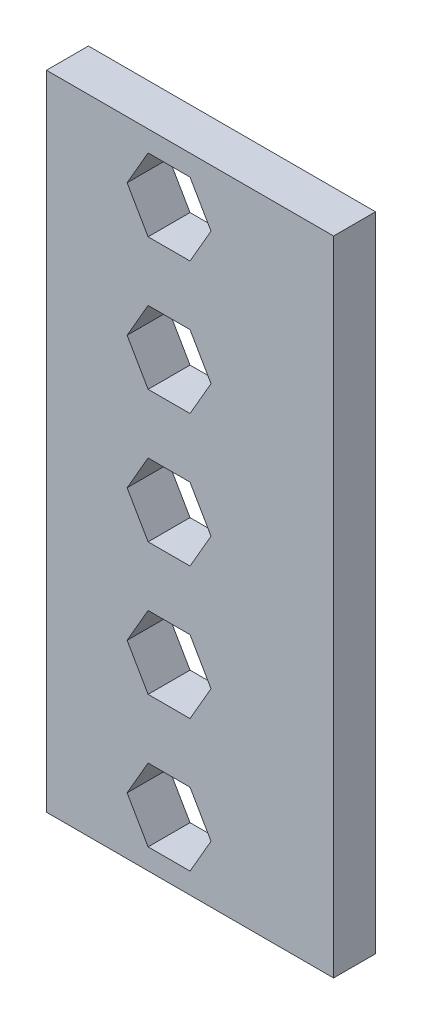
ISO-10303-21;
HEADER;
FILE_DESCRIPTION(('STEP AP214'),'2;1');
FILE_NAME('part.step','',(''),(''),'','','');
FILE_SCHEMA(('AUTOMOTIVE_DESIGN { 1 0 10303 214 1 1 1 1 }'));
ENDSEC;
DATA;
#1=APPLICATION_CONTEXT('core data for automotive mechanical design processes');
#2=APPLICATION_PROTOCOL_DEFINITION('international standard','automotive_design',2000,#1);
#3=PRODUCT_CONTEXT('',#1,'mechanical');
#4=PRODUCT('Part','Part','',(#3));
#5=PRODUCT_RELATED_PRODUCT_CATEGORY('part','',(#4));
#6=PRODUCT_DEFINITION_FORMATION('','',#4);
#7=PRODUCT_DEFINITION_CONTEXT('part definition',#1,'design');
#8=PRODUCT_DEFINITION('design','',#6,#7);
#9=PRODUCT_DEFINITION_SHAPE('','',#8);
#10=(LENGTH_UNIT() NAMED_UNIT(*) SI_UNIT(.MILLI.,.METRE.));
#11=(NAMED_UNIT(*) PLANE_ANGLE_UNIT() SI_UNIT($,.RADIAN.));
#12=(NAMED_UNIT(*) SI_UNIT($,.STERADIAN.) SOLID_ANGLE_UNIT());
#13=UNCERTAINTY_MEASURE_WITH_UNIT(LENGTH_MEASURE(1.E-05),#10,'distance_accuracy_value','');
#14=(GEOMETRIC_REPRESENTATION_CONTEXT(3) GLOBAL_UNCERTAINTY_ASSIGNED_CONTEXT((#13)) GLOBAL_UNIT_ASSIGNED_CONTEXT((#10,
#11,#12)) REPRESENTATION_CONTEXT('',''));
#15=CARTESIAN_POINT('',(0.,0.,0.));
#16=DIRECTION('',(0.,0.,1.));
#17=DIRECTION('',(1.,0.,0.));
#18=AXIS2_PLACEMENT_3D('',#15,#16,#17);
#19=CARTESIAN_POINT('',(0.,0.,3.175));
#20=DIRECTION('',(0.,0.,1.));
#21=DIRECTION('',(1.,0.,0.));
#22=AXIS2_PLACEMENT_3D('',#19,#20,#21);
#23=PLANE('',#22);
#24=DIRECTION('',(0.5,0.866025403784439,0.));
#25=VECTOR('',#24,1.);
#26=CARTESIAN_POINT('',(1.58771324027147,7.25,3.175));
#27=LINE('',#26,#25);
#28=CARTESIAN_POINT('',(1.58771324027147,7.25,3.175));
#29=VERTEX_POINT('',#28);
#30=CARTESIAN_POINT('',(3.17542648054294,10.,3.175));
#31=VERTEX_POINT('',#30);
#32=EDGE_CURVE('E56',#29,#31,#27,.T.);
#33=ORIENTED_EDGE('',*,*,#32,.F.);
#34=DIRECTION('',(1.,0.,0.));
#35=VECTOR('',#34,1.);
#36=CARTESIAN_POINT('',(-1.58771324027147,7.25,3.175));
#37=LINE('',#36,#35);
#38=CARTESIAN_POINT('',(-1.58771324027147,7.25,3.175));
#39=VERTEX_POINT('',#38);
#40=EDGE_CURVE('E294',#39,#29,#37,.T.);
#41=ORIENTED_EDGE('',*,*,#40,.F.);
#42=DIRECTION('',(0.5,-0.866025403784439,0.));
#43=VECTOR('',#42,1.);
#44=CARTESIAN_POINT('',(-3.17542648054294,9.99999999999999,3.175));
#45=LINE('',#44,#43);
#46=CARTESIAN_POINT('',(-3.17542648054294,9.99999999999999,3.175));
#47=VERTEX_POINT('',#46);
#48=EDGE_CURVE('E288',#47,#39,#45,.T.);
#49=ORIENTED_EDGE('',*,*,#48,.F.);
#50=DIRECTION('',(-0.5,-0.866025403784439,0.));
#51=VECTOR('',#50,1.);
#52=CARTESIAN_POINT('',(-1.58771324027146,12.75,3.175));
#53=LINE('',#52,#51);
#54=CARTESIAN_POINT('',(-1.58771324027146,12.75,3.175));
#55=VERTEX_POINT('',#54);
#56=EDGE_CURVE('E286',#55,#47,#53,.T.);
#57=ORIENTED_EDGE('',*,*,#56,.F.);
#58=DIRECTION('',(-1.,0.,0.));
#59=VECTOR('',#58,1.);
#60=CARTESIAN_POINT('',(1.58771324027147,12.75,3.175));
#61=LINE('',#60,#59);
#62=CARTESIAN_POINT('',(1.58771324027147,12.75,3.175));
#63=VERTEX_POINT('',#62);
#64=EDGE_CURVE('E269',#63,#55,#61,.T.);
#65=ORIENTED_EDGE('',*,*,#64,.F.);
#66=DIRECTION('',(-0.5,0.866025403784439,0.));
#67=VECTOR('',#66,1.);
#68=CARTESIAN_POINT('',(3.17542648054294,10.,3.175));
#69=LINE('',#68,#67);
#70=EDGE_CURVE('E279',#31,#63,#69,.T.);
#71=ORIENTED_EDGE('',*,*,#70,.F.);
#72=EDGE_LOOP('',(#33,#41,#49,#57,#65,#71));
#73=FACE_BOUND('',#72,.T.);
#74=DIRECTION('',(0.5,0.866025403784439,0.));
#75=VECTOR('',#74,1.);
#76=CARTESIAN_POINT('',(1.58771324027147,-2.75,3.175));
#77=LINE('',#76,#75);
#78=CARTESIAN_POINT('',(1.58771324027147,-2.75,3.175));
#79=VERTEX_POINT('',#78);
#80=CARTESIAN_POINT('',(3.17542648054294,0.,3.175));
#81=VERTEX_POINT('',#80);
#82=EDGE_CURVE('E64',#79,#81,#77,.T.);
#83=ORIENTED_EDGE('',*,*,#82,.F.);
#84=DIRECTION('',(1.,0.,0.));
#85=VECTOR('',#84,1.);
#86=CARTESIAN_POINT('',(-1.58771324027147,-2.75,3.175));
#87=LINE('',#86,#85);
#88=CARTESIAN_POINT('',(-1.58771324027147,-2.75,3.175));
#89=VERTEX_POINT('',#88);
#90=EDGE_CURVE('E320',#89,#79,#87,.T.);
#91=ORIENTED_EDGE('',*,*,#90,.F.);
#92=DIRECTION('',(0.5,-0.866025403784439,0.));
#93=VECTOR('',#92,1.);
#94=CARTESIAN_POINT('',(-3.17542648054294,0.,3.175));
#95=LINE('',#94,#93);
#96=CARTESIAN_POINT('',(-3.17542648054294,0.,3.175));
#97=VERTEX_POINT('',#96);
#98=EDGE_CURVE('E317',#97,#89,#95,.T.);
#99=ORIENTED_EDGE('',*,*,#98,.F.);
#100=DIRECTION('',(-0.5,-0.866025403784439,0.));
#101=VECTOR('',#100,1.);
#102=CARTESIAN_POINT('',(-1.58771324027146,2.75,3.175));
#103=LINE('',#102,#101);
#104=CARTESIAN_POINT('',(-1.58771324027146,2.75,3.175));
#105=VERTEX_POINT('',#104);
#106=EDGE_CURVE('E314',#105,#97,#103,.T.);
#107=ORIENTED_EDGE('',*,*,#106,.F.);
#108=DIRECTION('',(-1.,0.,0.));
#109=VECTOR('',#108,1.);
#110=CARTESIAN_POINT('',(1.58771324027147,2.75,3.175));
#111=LINE('',#110,#109);
#112=CARTESIAN_POINT('',(1.58771324027147,2.75,3.175));
#113=VERTEX_POINT('',#112);
#114=EDGE_CURVE('E311',#113,#105,#111,.T.);
#115=ORIENTED_EDGE('',*,*,#114,.F.);
#116=DIRECTION('',(-0.5,0.866025403784439,0.));
#117=VECTOR('',#116,1.);
#118=CARTESIAN_POINT('',(3.17542648054294,0.,3.175));
#119=LINE('',#118,#117);
#120=EDGE_CURVE('E307',#81,#113,#119,.T.);
#121=ORIENTED_EDGE('',*,*,#120,.F.);
#122=EDGE_LOOP('',(#83,#91,#99,#107,#115,#121));
#123=FACE_BOUND('',#122,.T.);
#124=DIRECTION('',(0.5,0.866025403784439,0.));
#125=VECTOR('',#124,1.);
#126=CARTESIAN_POINT('',(1.58771324027147,-12.75,3.175));
#127=LINE('',#126,#125);
#128=CARTESIAN_POINT('',(1.58771324027147,-12.75,3.175));
#129=VERTEX_POINT('',#128);
#130=CARTESIAN_POINT('',(3.17542648054294,-10.,3.175));
#131=VERTEX_POINT('',#130);
#132=EDGE_CURVE('E335',#129,#131,#127,.T.);
#133=ORIENTED_EDGE('',*,*,#132,.F.);
#134=DIRECTION('',(1.,0.,0.));
#135=VECTOR('',#134,1.);
#136=CARTESIAN_POINT('',(-1.58771324027147,-12.75,3.175));
#137=LINE('',#136,#135);
#138=CARTESIAN_POINT('',(-1.58771324027147,-12.75,3.175));
#139=VERTEX_POINT('',#138);
#140=EDGE_CURVE('E350',#139,#129,#137,.T.);
#141=ORIENTED_EDGE('',*,*,#140,.F.);
#142=DIRECTION('',(0.5,-0.866025403784439,0.));
#143=VECTOR('',#142,1.);
#144=CARTESIAN_POINT('',(-3.17542648054294,-10.,3.175));
#145=LINE('',#144,#143);
#146=CARTESIAN_POINT('',(-3.17542648054294,-10.,3.175));
#147=VERTEX_POINT('',#146);
#148=EDGE_CURVE('E347',#147,#139,#145,.T.);
#149=ORIENTED_EDGE('',*,*,#148,.F.);
#150=DIRECTION('',(-0.5,-0.866025403784439,0.));
#151=VECTOR('',#150,1.);
#152=CARTESIAN_POINT('',(-1.58771324027146,-7.25,3.175));
#153=LINE('',#152,#151);
#154=CARTESIAN_POINT('',(-1.58771324027146,-7.25,3.175));
#155=VERTEX_POINT('',#154);
#156=EDGE_CURVE('E344',#155,#147,#153,.T.);
#157=ORIENTED_EDGE('',*,*,#156,.F.);
#158=DIRECTION('',(-1.,0.,0.));
#159=VECTOR('',#158,1.);
#160=CARTESIAN_POINT('',(1.58771324027147,-7.25,3.175));
#161=LINE('',#160,#159);
#162=CARTESIAN_POINT('',(1.58771324027147,-7.25,3.175));
#163=VERTEX_POINT('',#162);
#164=EDGE_CURVE('E341',#163,#155,#161,.T.);
#165=ORIENTED_EDGE('',*,*,#164,.F.);
#166=DIRECTION('',(-0.5,0.866025403784439,0.));
#167=VECTOR('',#166,1.);
#168=CARTESIAN_POINT('',(3.17542648054294,-10.,3.175));
#169=LINE('',#168,#167);
#170=EDGE_CURVE('E337',#131,#163,#169,.T.);
#171=ORIENTED_EDGE('',*,*,#170,.F.);
#172=EDGE_LOOP('',(#133,#141,#149,#157,#165,#171));
#173=FACE_BOUND('',#172,.T.);
#174=DIRECTION('',(0.5,0.866025403784439,0.));
#175=VECTOR('',#174,1.);
#176=CARTESIAN_POINT('',(1.58771324027147,-22.75,3.175));
#177=LINE('',#176,#175);
#178=CARTESIAN_POINT('',(1.58771324027147,-22.75,3.175));
#179=VERTEX_POINT('',#178);
#180=CARTESIAN_POINT('',(3.17542648054294,-20.,3.175));
#181=VERTEX_POINT('',#180);
#182=EDGE_CURVE('E365',#179,#181,#177,.T.);
#183=ORIENTED_EDGE('',*,*,#182,.F.);
#184=DIRECTION('',(1.,0.,0.));
#185=VECTOR('',#184,1.);
#186=CARTESIAN_POINT('',(-1.58771324027147,-22.75,3.175));
#187=LINE('',#186,#185);
#188=CARTESIAN_POINT('',(-1.58771324027147,-22.75,3.175));
#189=VERTEX_POINT('',#188);
#190=EDGE_CURVE('E379',#189,#179,#187,.T.);
#191=ORIENTED_EDGE('',*,*,#190,.F.);
#192=DIRECTION('',(0.5,-0.866025403784439,0.));
#193=VECTOR('',#192,1.);
#194=CARTESIAN_POINT('',(-3.17542648054294,-20.,3.175));
#195=LINE('',#194,#193);
#196=CARTESIAN_POINT('',(-3.17542648054294,-20.,3.175));
#197=VERTEX_POINT('',#196);
#198=EDGE_CURVE('E376',#197,#189,#195,.T.);
#199=ORIENTED_EDGE('',*,*,#198,.F.);
#200=DIRECTION('',(-0.5,-0.866025403784439,0.));
#201=VECTOR('',#200,1.);
#202=CARTESIAN_POINT('',(-1.58771324027146,-17.25,3.175));
#203=LINE('',#202,#201);
#204=CARTESIAN_POINT('',(-1.58771324027146,-17.25,3.175));
#205=VERTEX_POINT('',#204);
#206=EDGE_CURVE('E373',#205,#197,#203,.T.);
#207=ORIENTED_EDGE('',*,*,#206,.F.);
#208=DIRECTION('',(-1.,0.,0.));
#209=VECTOR('',#208,1.);
#210=CARTESIAN_POINT('',(1.58771324027147,-17.25,3.175));
#211=LINE('',#210,#209);
#212=CARTESIAN_POINT('',(1.58771324027147,-17.25,3.175));
#213=VERTEX_POINT('',#212);
#214=EDGE_CURVE('E370',#213,#205,#211,.T.);
#215=ORIENTED_EDGE('',*,*,#214,.F.);
#216=DIRECTION('',(-0.5,0.866025403784439,0.));
#217=VECTOR('',#216,1.);
#218=CARTESIAN_POINT('',(3.17542648054294,-20.,3.175));
#219=LINE('',#218,#217);
#220=EDGE_CURVE('E367',#181,#213,#219,.T.);
#221=ORIENTED_EDGE('',*,*,#220,.F.);
#222=EDGE_LOOP('',(#183,#191,#199,#207,#215,#221));
#223=FACE_BOUND('',#222,.T.);
#224=DIRECTION('',(0.5,0.866025403784439,0.));
#225=VECTOR('',#224,1.);
#226=CARTESIAN_POINT('',(1.58771324027147,17.25,3.175));
#227=LINE('',#226,#225);
#228=CARTESIAN_POINT('',(1.58771324027147,17.25,3.175));
#229=VERTEX_POINT('',#228);
#230=CARTESIAN_POINT('',(3.17542648054294,20.,3.175));
#231=VERTEX_POINT('',#230);
#232=EDGE_CURVE('E299',#229,#231,#227,.T.);
#233=ORIENTED_EDGE('',*,*,#232,.F.);
#234=DIRECTION('',(1.,0.,0.));
#235=VECTOR('',#234,1.);
#236=CARTESIAN_POINT('',(-1.58771324027147,17.25,3.175));
#237=LINE('',#236,#235);
#238=CARTESIAN_POINT('',(-1.58771324027147,17.25,3.175));
#239=VERTEX_POINT('',#238);
#240=EDGE_CURVE('E407',#239,#229,#237,.T.);
#241=ORIENTED_EDGE('',*,*,#240,.F.);
#242=DIRECTION('',(0.5,-0.866025403784439,0.));
#243=VECTOR('',#242,1.);
#244=CARTESIAN_POINT('',(-3.17542648054294,20.,3.175));
#245=LINE('',#244,#243);
#246=CARTESIAN_POINT('',(-3.17542648054294,20.,3.175));
#247=VERTEX_POINT('',#246);
#248=EDGE_CURVE('E404',#247,#239,#245,.T.);
#249=ORIENTED_EDGE('',*,*,#248,.F.);
#250=DIRECTION('',(-0.5,-0.866025403784439,0.));
#251=VECTOR('',#250,1.);
#252=CARTESIAN_POINT('',(-1.58771324027146,22.75,3.175));
#253=LINE('',#252,#251);
#254=CARTESIAN_POINT('',(-1.58771324027146,22.75,3.175));
#255=VERTEX_POINT('',#254);
#256=EDGE_CURVE('E401',#255,#247,#253,.T.);
#257=ORIENTED_EDGE('',*,*,#256,.F.);
#258=DIRECTION('',(-1.,0.,0.));
#259=VECTOR('',#258,1.);
#260=CARTESIAN_POINT('',(1.58771324027147,22.75,3.175));
#261=LINE('',#260,#259);
#262=CARTESIAN_POINT('',(1.58771324027147,22.75,3.175));
#263=VERTEX_POINT('',#262);
#264=EDGE_CURVE('E398',#263,#255,#261,.T.);
#265=ORIENTED_EDGE('',*,*,#264,.F.);
#266=DIRECTION('',(-0.5,0.866025403784439,0.));
#267=VECTOR('',#266,1.);
#268=CARTESIAN_POINT('',(3.17542648054294,20.,3.175));
#269=LINE('',#268,#267);
#270=EDGE_CURVE('E395',#231,#263,#269,.T.);
#271=ORIENTED_EDGE('',*,*,#270,.F.);
#272=EDGE_LOOP('',(#233,#241,#249,#257,#265,#271));
#273=FACE_BOUND('',#272,.T.);
#274=DIRECTION('',(1.,0.,0.));
#275=VECTOR('',#274,1.);
#276=CARTESIAN_POINT('',(-6.10624999999999,24.325,3.175));
#277=LINE('',#276,#275);
#278=CARTESIAN_POINT('',(-9.28125,24.325,3.175));
#279=VERTEX_POINT('',#278);
#280=CARTESIAN_POINT('',(12.45625,24.325,3.175));
#281=VERTEX_POINT('',#280);
#282=EDGE_CURVE('E432',#279,#281,#277,.T.);
#283=ORIENTED_EDGE('',*,*,#282,.F.);
#284=DIRECTION('',(0.,1.,0.));
#285=VECTOR('',#284,1.);
#286=CARTESIAN_POINT('',(-9.28125,27.5,3.175));
#287=LINE('',#286,#285);
#288=CARTESIAN_POINT('',(-9.28124999999999,-24.325,3.175));
#289=VERTEX_POINT('',#288);
#290=EDGE_CURVE('E435',#289,#279,#287,.T.);
#291=ORIENTED_EDGE('',*,*,#290,.F.);
#292=DIRECTION('',(1.,0.,0.));
#293=VECTOR('',#292,1.);
#294=CARTESIAN_POINT('',(0.243750000000006,-24.325,3.175));
#295=LINE('',#294,#293);
#296=CARTESIAN_POINT('',(12.45625,-24.325,3.175));
#297=VERTEX_POINT('',#296);
#298=EDGE_CURVE('E427',#289,#297,#295,.T.);
#299=ORIENTED_EDGE('',*,*,#298,.T.);
#300=DIRECTION('',(0.,-1.,0.));
#301=VECTOR('',#300,1.);
#302=CARTESIAN_POINT('',(12.45625,-1.5875,3.175));
#303=LINE('',#302,#301);
#304=EDGE_CURVE('E438',#281,#297,#303,.T.);
#305=ORIENTED_EDGE('',*,*,#304,.F.);
#306=EDGE_LOOP('',(#283,#291,#299,#305));
#307=FACE_BOUND('',#306,.T.);
#308=ADVANCED_FACE('F41',(#73,#123,#173,#223,#273,#307),#23,.T.);
#309=CARTESIAN_POINT('',(0.,0.,0.));
#310=DIRECTION('',(0.,0.,1.));
#311=DIRECTION('',(1.,0.,0.));
#312=AXIS2_PLACEMENT_3D('',#309,#310,#311);
#313=PLANE('',#312);
#314=DIRECTION('',(1.,0.,0.));
#315=VECTOR('',#314,1.);
#316=CARTESIAN_POINT('',(0.,7.25,0.));
#317=LINE('',#316,#315);
#318=CARTESIAN_POINT('',(-1.58771324027147,7.25,0.));
#319=VERTEX_POINT('',#318);
#320=CARTESIAN_POINT('',(1.58771324027147,7.25,0.));
#321=VERTEX_POINT('',#320);
#322=EDGE_CURVE('E49',#319,#321,#317,.T.);
#323=ORIENTED_EDGE('',*,*,#322,.T.);
#324=DIRECTION('',(0.5,0.866025403784439,0.));
#325=VECTOR('',#324,1.);
#326=CARTESIAN_POINT('',(-1.94855715851499,1.125,0.));
#327=LINE('',#326,#325);
#328=CARTESIAN_POINT('',(3.17542648054294,10.,0.));
#329=VERTEX_POINT('',#328);
#330=EDGE_CURVE('E11',#321,#329,#327,.T.);
#331=ORIENTED_EDGE('',*,*,#330,.T.);
#332=DIRECTION('',(-0.5,0.866025403784439,0.));
#333=VECTOR('',#332,1.);
#334=CARTESIAN_POINT('',(6.7116968793294,3.87499999999999,0.));
#335=LINE('',#334,#333);
#336=CARTESIAN_POINT('',(1.58771324027147,12.75,0.));
#337=VERTEX_POINT('',#336);
#338=EDGE_CURVE('E529',#329,#337,#335,.T.);
#339=ORIENTED_EDGE('',*,*,#338,.T.);
#340=DIRECTION('',(-1.,0.,0.));
#341=VECTOR('',#340,1.);
#342=CARTESIAN_POINT('',(0.,12.75,0.));
#343=LINE('',#342,#341);
#344=CARTESIAN_POINT('',(-1.58771324027146,12.75,0.));
#345=VERTEX_POINT('',#344);
#346=EDGE_CURVE('E272',#337,#345,#343,.T.);
#347=ORIENTED_EDGE('',*,*,#346,.T.);
#348=DIRECTION('',(-0.5,-0.866025403784439,0.));
#349=VECTOR('',#348,1.);
#350=CARTESIAN_POINT('',(-6.71169687932939,3.875,0.));
#351=LINE('',#350,#349);
#352=CARTESIAN_POINT('',(-3.17542648054294,9.99999999999999,0.));
#353=VERTEX_POINT('',#352);
#354=EDGE_CURVE('E532',#345,#353,#351,.T.);
#355=ORIENTED_EDGE('',*,*,#354,.T.);
#356=DIRECTION('',(0.5,-0.866025403784439,0.));
#357=VECTOR('',#356,1.);
#358=CARTESIAN_POINT('',(1.94855715851498,1.125,0.));
#359=LINE('',#358,#357);
#360=EDGE_CURVE('E535',#353,#319,#359,.T.);
#361=ORIENTED_EDGE('',*,*,#360,.T.);
#362=EDGE_LOOP('',(#323,#331,#339,#347,#355,#361));
#363=FACE_BOUND('',#362,.T.);
#364=DIRECTION('',(1.,0.,0.));
#365=VECTOR('',#364,1.);
#366=CARTESIAN_POINT('',(0.,-2.75,0.));
#367=LINE('',#366,#365);
#368=CARTESIAN_POINT('',(-1.58771324027147,-2.75,0.));
#369=VERTEX_POINT('',#368);
#370=CARTESIAN_POINT('',(1.58771324027147,-2.75,0.));
#371=VERTEX_POINT('',#370);
#372=EDGE_CURVE('E523',#369,#371,#367,.T.);
#373=ORIENTED_EDGE('',*,*,#372,.T.);
#374=DIRECTION('',(0.5,0.866025403784439,0.));
#375=VECTOR('',#374,1.);
#376=CARTESIAN_POINT('',(2.38156986040721,-1.375,0.));
#377=LINE('',#376,#375);
#378=CARTESIAN_POINT('',(3.17542648054294,0.,0.));
#379=VERTEX_POINT('',#378);
#380=EDGE_CURVE('E526',#371,#379,#377,.T.);
#381=ORIENTED_EDGE('',*,*,#380,.T.);
#382=DIRECTION('',(-0.5,0.866025403784439,0.));
#383=VECTOR('',#382,1.);
#384=CARTESIAN_POINT('',(2.38156986040721,1.375,0.));
#385=LINE('',#384,#383);
#386=CARTESIAN_POINT('',(1.58771324027147,2.75,0.));
#387=VERTEX_POINT('',#386);
#388=EDGE_CURVE('E511',#379,#387,#385,.T.);
#389=ORIENTED_EDGE('',*,*,#388,.T.);
#390=DIRECTION('',(-1.,0.,0.));
#391=VECTOR('',#390,1.);
#392=CARTESIAN_POINT('',(0.,2.75,0.));
#393=LINE('',#392,#391);
#394=CARTESIAN_POINT('',(-1.58771324027146,2.75,0.));
#395=VERTEX_POINT('',#394);
#396=EDGE_CURVE('E514',#387,#395,#393,.T.);
#397=ORIENTED_EDGE('',*,*,#396,.T.);
#398=DIRECTION('',(-0.5,-0.866025403784439,0.));
#399=VECTOR('',#398,1.);
#400=CARTESIAN_POINT('',(-2.3815698604072,1.375,0.));
#401=LINE('',#400,#399);
#402=CARTESIAN_POINT('',(-3.17542648054294,0.,0.));
#403=VERTEX_POINT('',#402);
#404=EDGE_CURVE('E517',#395,#403,#401,.T.);
#405=ORIENTED_EDGE('',*,*,#404,.T.);
#406=DIRECTION('',(0.5,-0.866025403784439,0.));
#407=VECTOR('',#406,1.);
#408=CARTESIAN_POINT('',(-2.38156986040721,-1.375,0.));
#409=LINE('',#408,#407);
#410=EDGE_CURVE('E520',#403,#369,#409,.T.);
#411=ORIENTED_EDGE('',*,*,#410,.T.);
#412=EDGE_LOOP('',(#373,#381,#389,#397,#405,#411));
#413=FACE_BOUND('',#412,.T.);
#414=DIRECTION('',(1.,0.,0.));
#415=VECTOR('',#414,1.);
#416=CARTESIAN_POINT('',(0.,-12.75,0.));
#417=LINE('',#416,#415);
#418=CARTESIAN_POINT('',(-1.58771324027147,-12.75,0.));
#419=VERTEX_POINT('',#418);
#420=CARTESIAN_POINT('',(1.58771324027147,-12.75,0.));
#421=VERTEX_POINT('',#420);
#422=EDGE_CURVE('E505',#419,#421,#417,.T.);
#423=ORIENTED_EDGE('',*,*,#422,.T.);
#424=DIRECTION('',(0.5,0.866025403784439,0.));
#425=VECTOR('',#424,1.);
#426=CARTESIAN_POINT('',(6.7116968793294,-3.875,0.));
#427=LINE('',#426,#425);
#428=CARTESIAN_POINT('',(3.17542648054294,-10.,0.));
#429=VERTEX_POINT('',#428);
#430=EDGE_CURVE('E508',#421,#429,#427,.T.);
#431=ORIENTED_EDGE('',*,*,#430,.T.);
#432=DIRECTION('',(-0.5,0.866025403784439,0.));
#433=VECTOR('',#432,1.);
#434=CARTESIAN_POINT('',(-1.94855715851498,-1.125,0.));
#435=LINE('',#434,#433);
#436=CARTESIAN_POINT('',(1.58771324027147,-7.25,0.));
#437=VERTEX_POINT('',#436);
#438=EDGE_CURVE('E493',#429,#437,#435,.T.);
#439=ORIENTED_EDGE('',*,*,#438,.T.);
#440=DIRECTION('',(-1.,0.,0.));
#441=VECTOR('',#440,1.);
#442=CARTESIAN_POINT('',(0.,-7.25,0.));
#443=LINE('',#442,#441);
#444=CARTESIAN_POINT('',(-1.58771324027146,-7.25,0.));
#445=VERTEX_POINT('',#444);
#446=EDGE_CURVE('E496',#437,#445,#443,.T.);
#447=ORIENTED_EDGE('',*,*,#446,.T.);
#448=DIRECTION('',(-0.5,-0.866025403784439,0.));
#449=VECTOR('',#448,1.);
#450=CARTESIAN_POINT('',(1.94855715851499,-1.125,0.));
#451=LINE('',#450,#449);
#452=CARTESIAN_POINT('',(-3.17542648054294,-10.,0.));
#453=VERTEX_POINT('',#452);
#454=EDGE_CURVE('E499',#445,#453,#451,.T.);
#455=ORIENTED_EDGE('',*,*,#454,.T.);
#456=DIRECTION('',(0.5,-0.866025403784439,0.));
#457=VECTOR('',#456,1.);
#458=CARTESIAN_POINT('',(-6.7116968793294,-3.875,0.));
#459=LINE('',#458,#457);
#460=EDGE_CURVE('E502',#453,#419,#459,.T.);
#461=ORIENTED_EDGE('',*,*,#460,.T.);
#462=EDGE_LOOP('',(#423,#431,#439,#447,#455,#461));
#463=FACE_BOUND('',#462,.T.);
#464=DIRECTION('',(1.,0.,0.));
#465=VECTOR('',#464,1.);
#466=CARTESIAN_POINT('',(0.,-22.75,0.));
#467=LINE('',#466,#465);
#468=CARTESIAN_POINT('',(-1.58771324027147,-22.75,0.));
#469=VERTEX_POINT('',#468);
#470=CARTESIAN_POINT('',(1.58771324027147,-22.75,0.));
#471=VERTEX_POINT('',#470);
#472=EDGE_CURVE('E487',#469,#471,#467,.T.);
#473=ORIENTED_EDGE('',*,*,#472,.T.);
#474=DIRECTION('',(0.5,0.866025403784439,0.));
#475=VECTOR('',#474,1.);
#476=CARTESIAN_POINT('',(11.0418238982516,-6.37500000000001,0.));
#477=LINE('',#476,#475);
#478=CARTESIAN_POINT('',(3.17542648054294,-20.,0.));
#479=VERTEX_POINT('',#478);
#480=EDGE_CURVE('E490',#471,#479,#477,.T.);
#481=ORIENTED_EDGE('',*,*,#480,.T.);
#482=DIRECTION('',(-0.5,0.866025403784439,0.));
#483=VECTOR('',#482,1.);
#484=CARTESIAN_POINT('',(-6.27868417743717,-3.62499999999999,0.));
#485=LINE('',#484,#483);
#486=CARTESIAN_POINT('',(1.58771324027147,-17.25,0.));
#487=VERTEX_POINT('',#486);
#488=EDGE_CURVE('E475',#479,#487,#485,.T.);
#489=ORIENTED_EDGE('',*,*,#488,.T.);
#490=DIRECTION('',(-1.,0.,0.));
#491=VECTOR('',#490,1.);
#492=CARTESIAN_POINT('',(0.,-17.25,0.));
#493=LINE('',#492,#491);
#494=CARTESIAN_POINT('',(-1.58771324027146,-17.25,0.));
#495=VERTEX_POINT('',#494);
#496=EDGE_CURVE('E478',#487,#495,#493,.T.);
#497=ORIENTED_EDGE('',*,*,#496,.T.);
#498=DIRECTION('',(-0.5,-0.866025403784439,0.));
#499=VECTOR('',#498,1.);
#500=CARTESIAN_POINT('',(6.27868417743719,-3.625,0.));
#501=LINE('',#500,#499);
#502=CARTESIAN_POINT('',(-3.17542648054294,-20.,0.));
#503=VERTEX_POINT('',#502);
#504=EDGE_CURVE('E481',#495,#503,#501,.T.);
#505=ORIENTED_EDGE('',*,*,#504,.T.);
#506=DIRECTION('',(0.5,-0.866025403784439,0.));
#507=VECTOR('',#506,1.);
#508=CARTESIAN_POINT('',(-11.0418238982516,-6.375,0.));
#509=LINE('',#508,#507);
#510=EDGE_CURVE('E484',#503,#469,#509,.T.);
#511=ORIENTED_EDGE('',*,*,#510,.T.);
#512=EDGE_LOOP('',(#473,#481,#489,#497,#505,#511));
#513=FACE_BOUND('',#512,.T.);
#514=DIRECTION('',(1.,0.,0.));
#515=VECTOR('',#514,1.);
#516=CARTESIAN_POINT('',(0.,17.25,0.));
#517=LINE('',#516,#515);
#518=CARTESIAN_POINT('',(-1.58771324027147,17.25,0.));
#519=VERTEX_POINT('',#518);
#520=CARTESIAN_POINT('',(1.58771324027147,17.25,0.));
#521=VERTEX_POINT('',#520);
#522=EDGE_CURVE('E469',#519,#521,#517,.T.);
#523=ORIENTED_EDGE('',*,*,#522,.T.);
#524=DIRECTION('',(0.5,0.866025403784439,0.));
#525=VECTOR('',#524,1.);
#526=CARTESIAN_POINT('',(-6.27868417743718,3.625,0.));
#527=LINE('',#526,#525);
#528=CARTESIAN_POINT('',(3.17542648054294,20.,0.));
#529=VERTEX_POINT('',#528);
#530=EDGE_CURVE('E472',#521,#529,#527,.T.);
#531=ORIENTED_EDGE('',*,*,#530,.T.);
#532=DIRECTION('',(-0.5,0.866025403784439,0.));
#533=VECTOR('',#532,1.);
#534=CARTESIAN_POINT('',(11.0418238982516,6.37499999999999,0.));
#535=LINE('',#534,#533);
#536=CARTESIAN_POINT('',(1.58771324027147,22.75,0.));
#537=VERTEX_POINT('',#536);
#538=EDGE_CURVE('E457',#529,#537,#535,.T.);
#539=ORIENTED_EDGE('',*,*,#538,.T.);
#540=DIRECTION('',(-1.,0.,0.));
#541=VECTOR('',#540,1.);
#542=CARTESIAN_POINT('',(0.,22.75,0.));
#543=LINE('',#542,#541);
#544=CARTESIAN_POINT('',(-1.58771324027146,22.75,0.));
#545=VERTEX_POINT('',#544);
#546=EDGE_CURVE('E460',#537,#545,#543,.T.);
#547=ORIENTED_EDGE('',*,*,#546,.T.);
#548=DIRECTION('',(-0.5,-0.866025403784439,0.));
#549=VECTOR('',#548,1.);
#550=CARTESIAN_POINT('',(-11.0418238982516,6.375,0.));
#551=LINE('',#550,#549);
#552=CARTESIAN_POINT('',(-3.17542648054294,20.,0.));
#553=VERTEX_POINT('',#552);
#554=EDGE_CURVE('E463',#545,#553,#551,.T.);
#555=ORIENTED_EDGE('',*,*,#554,.T.);
#556=DIRECTION('',(0.5,-0.866025403784439,0.));
#557=VECTOR('',#556,1.);
#558=CARTESIAN_POINT('',(6.27868417743718,3.625,0.));
#559=LINE('',#558,#557);
#560=EDGE_CURVE('E466',#553,#519,#559,.T.);
#561=ORIENTED_EDGE('',*,*,#560,.T.);
#562=EDGE_LOOP('',(#523,#531,#539,#547,#555,#561));
#563=FACE_BOUND('',#562,.T.);
#564=DIRECTION('',(0.,1.,0.));
#565=VECTOR('',#564,1.);
#566=CARTESIAN_POINT('',(-9.28125,0.,0.));
#567=LINE('',#566,#565);
#568=CARTESIAN_POINT('',(-9.28124999999999,-24.325,0.));
#569=VERTEX_POINT('',#568);
#570=CARTESIAN_POINT('',(-9.28125,24.325,0.));
#571=VERTEX_POINT('',#570);
#572=EDGE_CURVE('E442',#569,#571,#567,.T.);
#573=ORIENTED_EDGE('',*,*,#572,.T.);
#574=DIRECTION('',(1.,0.,0.));
#575=VECTOR('',#574,1.);
#576=CARTESIAN_POINT('',(0.,24.325,0.));
#577=LINE('',#576,#575);
#578=CARTESIAN_POINT('',(12.45625,24.325,0.));
#579=VERTEX_POINT('',#578);
#580=EDGE_CURVE('E445',#571,#579,#577,.T.);
#581=ORIENTED_EDGE('',*,*,#580,.T.);
#582=DIRECTION('',(0.,-1.,0.));
#583=VECTOR('',#582,1.);
#584=CARTESIAN_POINT('',(12.45625,0.,0.));
#585=LINE('',#584,#583);
#586=CARTESIAN_POINT('',(12.45625,-24.325,0.));
#587=VERTEX_POINT('',#586);
#588=EDGE_CURVE('E440',#579,#587,#585,.T.);
#589=ORIENTED_EDGE('',*,*,#588,.T.);
#590=DIRECTION('',(1.,0.,0.));
#591=VECTOR('',#590,1.);
#592=CARTESIAN_POINT('',(0.,-24.325,0.));
#593=LINE('',#592,#591);
#594=EDGE_CURVE('E451',#569,#587,#593,.T.);
#595=ORIENTED_EDGE('',*,*,#594,.F.);
#596=EDGE_LOOP('',(#573,#581,#589,#595));
#597=FACE_BOUND('',#596,.T.);
#598=ADVANCED_FACE('F43',(#363,#413,#463,#513,#563,#597),#313,.F.);
#599=CARTESIAN_POINT('',(12.45625,-1.5875,-6.825));
#600=DIRECTION('',(-1.,0.,0.));
#601=DIRECTION('',(0.,0.,1.));
#602=AXIS2_PLACEMENT_3D('',#599,#600,#601);
#603=PLANE('',#602);
#604=ORIENTED_EDGE('',*,*,#588,.F.);
#605=DIRECTION('',(0.,0.,1.));
#606=VECTOR('',#605,1.);
#607=CARTESIAN_POINT('',(12.45625,24.325,-6.825));
#608=LINE('',#607,#606);
#609=EDGE_CURVE('E448',#579,#281,#608,.T.);
#610=ORIENTED_EDGE('',*,*,#609,.T.);
#611=ORIENTED_EDGE('',*,*,#304,.T.);
#612=DIRECTION('',(0.,0.,1.));
#613=VECTOR('',#612,1.);
#614=CARTESIAN_POINT('',(12.45625,-24.325,-6.825));
#615=LINE('',#614,#613);
#616=EDGE_CURVE('E454',#587,#297,#615,.T.);
#617=ORIENTED_EDGE('',*,*,#616,.F.);
#618=EDGE_LOOP('',(#604,#610,#611,#617));
#619=FACE_BOUND('',#618,.T.);
#620=ADVANCED_FACE('F569',(#619),#603,.F.);
#621=CARTESIAN_POINT('',(-9.28125,27.5,-6.825));
#622=DIRECTION('',(1.,0.,0.));
#623=DIRECTION('',(0.,1.,0.));
#624=AXIS2_PLACEMENT_3D('',#621,#622,#623);
#625=PLANE('',#624);
#626=ORIENTED_EDGE('',*,*,#290,.T.);
#627=DIRECTION('',(0.,0.,1.));
#628=VECTOR('',#627,1.);
#629=CARTESIAN_POINT('',(-9.28125,24.325,-6.825));
#630=LINE('',#629,#628);
#631=EDGE_CURVE('E424',#571,#279,#630,.T.);
#632=ORIENTED_EDGE('',*,*,#631,.F.);
#633=ORIENTED_EDGE('',*,*,#572,.F.);
#634=DIRECTION('',(0.,0.,1.));
#635=VECTOR('',#634,1.);
#636=CARTESIAN_POINT('',(-9.28124999999999,-24.325,-6.825));
#637=LINE('',#636,#635);
#638=EDGE_CURVE('E413',#569,#289,#637,.T.);
#639=ORIENTED_EDGE('',*,*,#638,.T.);
#640=EDGE_LOOP('',(#626,#632,#633,#639));
#641=FACE_BOUND('',#640,.T.);
#642=ADVANCED_FACE('F573',(#641),#625,.F.);
#643=CARTESIAN_POINT('',(-6.10624999999999,24.325,-6.825));
#644=DIRECTION('',(0.,-1.,0.));
#645=DIRECTION('',(0.,0.,-1.));
#646=AXIS2_PLACEMENT_3D('',#643,#644,#645);
#647=PLANE('',#646);
#648=ORIENTED_EDGE('',*,*,#580,.F.);
#649=ORIENTED_EDGE('',*,*,#631,.T.);
#650=ORIENTED_EDGE('',*,*,#282,.T.);
#651=ORIENTED_EDGE('',*,*,#609,.F.);
#652=EDGE_LOOP('',(#648,#649,#650,#651));
#653=FACE_BOUND('',#652,.T.);
#654=ADVANCED_FACE('F577',(#653),#647,.F.);
#655=CARTESIAN_POINT('',(0.243750000000006,-24.325,-6.825));
#656=DIRECTION('',(0.,-1.,0.));
#657=DIRECTION('',(0.,0.,-1.));
#658=AXIS2_PLACEMENT_3D('',#655,#656,#657);
#659=PLANE('',#658);
#660=ORIENTED_EDGE('',*,*,#594,.T.);
#661=ORIENTED_EDGE('',*,*,#616,.T.);
#662=ORIENTED_EDGE('',*,*,#298,.F.);
#663=ORIENTED_EDGE('',*,*,#638,.F.);
#664=EDGE_LOOP('',(#660,#661,#662,#663));
#665=FACE_BOUND('',#664,.T.);
#666=ADVANCED_FACE('F581',(#665),#659,.T.);
#667=CARTESIAN_POINT('',(1.58771324027147,17.25,-6.825));
#668=DIRECTION('',(0.866025403784438,-0.5,0.));
#669=DIRECTION('',(0.5,0.866025403784439,0.));
#670=AXIS2_PLACEMENT_3D('',#667,#668,#669);
#671=PLANE('',#670);
#672=DIRECTION('',(0.,0.,1.));
#673=VECTOR('',#672,1.);
#674=CARTESIAN_POINT('',(1.58771324027147,17.25,-6.825));
#675=LINE('',#674,#673);
#676=EDGE_CURVE('E411',#521,#229,#675,.T.);
#677=ORIENTED_EDGE('',*,*,#676,.T.);
#678=ORIENTED_EDGE('',*,*,#232,.T.);
#679=DIRECTION('',(0.,0.,1.));
#680=VECTOR('',#679,1.);
#681=CARTESIAN_POINT('',(3.17542648054294,20.,-6.825));
#682=LINE('',#681,#680);
#683=EDGE_CURVE('E410',#529,#231,#682,.T.);
#684=ORIENTED_EDGE('',*,*,#683,.F.);
#685=ORIENTED_EDGE('',*,*,#530,.F.);
#686=EDGE_LOOP('',(#677,#678,#684,#685));
#687=FACE_BOUND('',#686,.T.);
#688=ADVANCED_FACE('F585',(#687),#671,.F.);
#689=CARTESIAN_POINT('',(-1.58771324027147,17.25,-6.825));
#690=DIRECTION('',(0.,-1.,0.));
#691=DIRECTION('',(0.,0.,-1.));
#692=AXIS2_PLACEMENT_3D('',#689,#690,#691);
#693=PLANE('',#692);
#694=DIRECTION('',(0.,0.,1.));
#695=VECTOR('',#694,1.);
#696=CARTESIAN_POINT('',(-1.58771324027147,17.25,-6.825));
#697=LINE('',#696,#695);
#698=EDGE_CURVE('E414',#519,#239,#697,.T.);
#699=ORIENTED_EDGE('',*,*,#698,.T.);
#700=ORIENTED_EDGE('',*,*,#240,.T.);
#701=ORIENTED_EDGE('',*,*,#676,.F.);
#702=ORIENTED_EDGE('',*,*,#522,.F.);
#703=EDGE_LOOP('',(#699,#700,#701,#702));
#704=FACE_BOUND('',#703,.T.);
#705=ADVANCED_FACE('F589',(#704),#693,.F.);
#706=CARTESIAN_POINT('',(-3.17542648054294,20.,-6.825));
#707=DIRECTION('',(-0.866025403784439,-0.5,0.));
#708=DIRECTION('',(0.5,-0.866025403784439,0.));
#709=AXIS2_PLACEMENT_3D('',#706,#707,#708);
#710=PLANE('',#709);
#711=DIRECTION('',(0.,0.,1.));
#712=VECTOR('',#711,1.);
#713=CARTESIAN_POINT('',(-3.17542648054294,20.,-6.825));
#714=LINE('',#713,#712);
#715=EDGE_CURVE('E416',#553,#247,#714,.T.);
#716=ORIENTED_EDGE('',*,*,#715,.T.);
#717=ORIENTED_EDGE('',*,*,#248,.T.);
#718=ORIENTED_EDGE('',*,*,#698,.F.);
#719=ORIENTED_EDGE('',*,*,#560,.F.);
#720=EDGE_LOOP('',(#716,#717,#718,#719));
#721=FACE_BOUND('',#720,.T.);
#722=ADVANCED_FACE('F602',(#721),#710,.F.);
#723=CARTESIAN_POINT('',(-1.58771324027146,22.75,-6.825));
#724=DIRECTION('',(-0.866025403784439,0.5,0.));
#725=DIRECTION('',(-0.5,-0.866025403784439,0.));
#726=AXIS2_PLACEMENT_3D('',#723,#724,#725);
#727=PLANE('',#726);
#728=DIRECTION('',(0.,0.,1.));
#729=VECTOR('',#728,1.);
#730=CARTESIAN_POINT('',(-1.58771324027146,22.75,-6.825));
#731=LINE('',#730,#729);
#732=EDGE_CURVE('E418',#545,#255,#731,.T.);
#733=ORIENTED_EDGE('',*,*,#732,.T.);
#734=ORIENTED_EDGE('',*,*,#256,.T.);
#735=ORIENTED_EDGE('',*,*,#715,.F.);
#736=ORIENTED_EDGE('',*,*,#554,.F.);
#737=EDGE_LOOP('',(#733,#734,#735,#736));
#738=FACE_BOUND('',#737,.T.);
#739=ADVANCED_FACE('F598',(#738),#727,.F.);
#740=CARTESIAN_POINT('',(1.58771324027147,22.75,-6.825));
#741=DIRECTION('',(0.,1.,0.));
#742=DIRECTION('',(0.,0.,1.));
#743=AXIS2_PLACEMENT_3D('',#740,#741,#742);
#744=PLANE('',#743);
#745=DIRECTION('',(0.,0.,1.));
#746=VECTOR('',#745,1.);
#747=CARTESIAN_POINT('',(1.58771324027147,22.75,-6.825));
#748=LINE('',#747,#746);
#749=EDGE_CURVE('E420',#537,#263,#748,.T.);
#750=ORIENTED_EDGE('',*,*,#749,.T.);
#751=ORIENTED_EDGE('',*,*,#264,.T.);
#752=ORIENTED_EDGE('',*,*,#732,.F.);
#753=ORIENTED_EDGE('',*,*,#546,.F.);
#754=EDGE_LOOP('',(#750,#751,#752,#753));
#755=FACE_BOUND('',#754,.T.);
#756=ADVANCED_FACE('F594',(#755),#744,.F.);
#757=CARTESIAN_POINT('',(3.17542648054294,20.,-6.825));
#758=DIRECTION('',(0.866025403784439,0.5,0.));
#759=DIRECTION('',(-0.5,0.866025403784439,0.));
#760=AXIS2_PLACEMENT_3D('',#757,#758,#759);
#761=PLANE('',#760);
#762=ORIENTED_EDGE('',*,*,#683,.T.);
#763=ORIENTED_EDGE('',*,*,#270,.T.);
#764=ORIENTED_EDGE('',*,*,#749,.F.);
#765=ORIENTED_EDGE('',*,*,#538,.F.);
#766=EDGE_LOOP('',(#762,#763,#764,#765));
#767=FACE_BOUND('',#766,.T.);
#768=ADVANCED_FACE('F591',(#767),#761,.F.);
#769=CARTESIAN_POINT('',(1.58771324027147,-22.75,-6.825));
#770=DIRECTION('',(0.866025403784438,-0.5,0.));
#771=DIRECTION('',(0.5,0.866025403784439,0.));
#772=AXIS2_PLACEMENT_3D('',#769,#770,#771);
#773=PLANE('',#772);
#774=DIRECTION('',(0.,0.,1.));
#775=VECTOR('',#774,1.);
#776=CARTESIAN_POINT('',(1.58771324027147,-22.75,-6.825));
#777=LINE('',#776,#775);
#778=EDGE_CURVE('E338',#471,#179,#777,.T.);
#779=ORIENTED_EDGE('',*,*,#778,.T.);
#780=ORIENTED_EDGE('',*,*,#182,.T.);
#781=DIRECTION('',(0.,0.,1.));
#782=VECTOR('',#781,1.);
#783=CARTESIAN_POINT('',(3.17542648054294,-20.,-6.825));
#784=LINE('',#783,#782);
#785=EDGE_CURVE('E382',#479,#181,#784,.T.);
#786=ORIENTED_EDGE('',*,*,#785,.F.);
#787=ORIENTED_EDGE('',*,*,#480,.F.);
#788=EDGE_LOOP('',(#779,#780,#786,#787));
#789=FACE_BOUND('',#788,.T.);
#790=ADVANCED_FACE('F593',(#789),#773,.F.);
#791=CARTESIAN_POINT('',(-1.58771324027147,-22.75,-6.825));
#792=DIRECTION('',(0.,-1.,0.));
#793=DIRECTION('',(0.,0.,-1.));
#794=AXIS2_PLACEMENT_3D('',#791,#792,#793);
#795=PLANE('',#794);
#796=DIRECTION('',(0.,0.,1.));
#797=VECTOR('',#796,1.);
#798=CARTESIAN_POINT('',(-1.58771324027147,-22.75,-6.825));
#799=LINE('',#798,#797);
#800=EDGE_CURVE('E384',#469,#189,#799,.T.);
#801=ORIENTED_EDGE('',*,*,#800,.T.);
#802=ORIENTED_EDGE('',*,*,#190,.T.);
#803=ORIENTED_EDGE('',*,*,#778,.F.);
#804=ORIENTED_EDGE('',*,*,#472,.F.);
#805=EDGE_LOOP('',(#801,#802,#803,#804));
#806=FACE_BOUND('',#805,.T.);
#807=ADVANCED_FACE('F612',(#806),#795,.F.);
#808=CARTESIAN_POINT('',(-3.17542648054294,-20.,-6.825));
#809=DIRECTION('',(-0.866025403784439,-0.5,0.));
#810=DIRECTION('',(0.5,-0.866025403784439,0.));
#811=AXIS2_PLACEMENT_3D('',#808,#809,#810);
#812=PLANE('',#811);
#813=DIRECTION('',(0.,0.,1.));
#814=VECTOR('',#813,1.);
#815=CARTESIAN_POINT('',(-3.17542648054294,-20.,-6.825));
#816=LINE('',#815,#814);
#817=EDGE_CURVE('E386',#503,#197,#816,.T.);
#818=ORIENTED_EDGE('',*,*,#817,.T.);
#819=ORIENTED_EDGE('',*,*,#198,.T.);
#820=ORIENTED_EDGE('',*,*,#800,.F.);
#821=ORIENTED_EDGE('',*,*,#510,.F.);
#822=EDGE_LOOP('',(#818,#819,#820,#821));
#823=FACE_BOUND('',#822,.T.);
#824=ADVANCED_FACE('F626',(#823),#812,.F.);
#825=CARTESIAN_POINT('',(-1.58771324027146,-17.25,-6.825));
#826=DIRECTION('',(-0.866025403784439,0.5,0.));
#827=DIRECTION('',(-0.5,-0.866025403784439,0.));
#828=AXIS2_PLACEMENT_3D('',#825,#826,#827);
#829=PLANE('',#828);
#830=DIRECTION('',(0.,0.,1.));
#831=VECTOR('',#830,1.);
#832=CARTESIAN_POINT('',(-1.58771324027146,-17.25,-6.825));
#833=LINE('',#832,#831);
#834=EDGE_CURVE('E388',#495,#205,#833,.T.);
#835=ORIENTED_EDGE('',*,*,#834,.T.);
#836=ORIENTED_EDGE('',*,*,#206,.T.);
#837=ORIENTED_EDGE('',*,*,#817,.F.);
#838=ORIENTED_EDGE('',*,*,#504,.F.);
#839=EDGE_LOOP('',(#835,#836,#837,#838));
#840=FACE_BOUND('',#839,.T.);
#841=ADVANCED_FACE('F622',(#840),#829,.F.);
#842=CARTESIAN_POINT('',(1.58771324027147,-17.25,-6.825));
#843=DIRECTION('',(0.,1.,0.));
#844=DIRECTION('',(0.,0.,1.));
#845=AXIS2_PLACEMENT_3D('',#842,#843,#844);
#846=PLANE('',#845);
#847=DIRECTION('',(0.,0.,1.));
#848=VECTOR('',#847,1.);
#849=CARTESIAN_POINT('',(1.58771324027147,-17.25,-6.825));
#850=LINE('',#849,#848);
#851=EDGE_CURVE('E390',#487,#213,#850,.T.);
#852=ORIENTED_EDGE('',*,*,#851,.T.);
#853=ORIENTED_EDGE('',*,*,#214,.T.);
#854=ORIENTED_EDGE('',*,*,#834,.F.);
#855=ORIENTED_EDGE('',*,*,#496,.F.);
#856=EDGE_LOOP('',(#852,#853,#854,#855));
#857=FACE_BOUND('',#856,.T.);
#858=ADVANCED_FACE('F618',(#857),#846,.F.);
#859=CARTESIAN_POINT('',(3.17542648054294,-20.,-6.825));
#860=DIRECTION('',(0.866025403784439,0.5,0.));
#861=DIRECTION('',(-0.5,0.866025403784439,0.));
#862=AXIS2_PLACEMENT_3D('',#859,#860,#861);
#863=PLANE('',#862);
#864=ORIENTED_EDGE('',*,*,#785,.T.);
#865=ORIENTED_EDGE('',*,*,#220,.T.);
#866=ORIENTED_EDGE('',*,*,#851,.F.);
#867=ORIENTED_EDGE('',*,*,#488,.F.);
#868=EDGE_LOOP('',(#864,#865,#866,#867));
#869=FACE_BOUND('',#868,.T.);
#870=ADVANCED_FACE('F614',(#869),#863,.F.);
#871=CARTESIAN_POINT('',(1.58771324027147,-12.75,-6.825));
#872=DIRECTION('',(0.866025403784438,-0.5,0.));
#873=DIRECTION('',(0.5,0.866025403784439,0.));
#874=AXIS2_PLACEMENT_3D('',#871,#872,#873);
#875=PLANE('',#874);
#876=DIRECTION('',(0.,0.,1.));
#877=VECTOR('',#876,1.);
#878=CARTESIAN_POINT('',(1.58771324027147,-12.75,-6.825));
#879=LINE('',#878,#877);
#880=EDGE_CURVE('E308',#421,#129,#879,.T.);
#881=ORIENTED_EDGE('',*,*,#880,.T.);
#882=ORIENTED_EDGE('',*,*,#132,.T.);
#883=DIRECTION('',(0.,0.,1.));
#884=VECTOR('',#883,1.);
#885=CARTESIAN_POINT('',(3.17542648054294,-10.,-6.825));
#886=LINE('',#885,#884);
#887=EDGE_CURVE('E353',#429,#131,#886,.T.);
#888=ORIENTED_EDGE('',*,*,#887,.F.);
#889=ORIENTED_EDGE('',*,*,#430,.F.);
#890=EDGE_LOOP('',(#881,#882,#888,#889));
#891=FACE_BOUND('',#890,.T.);
#892=ADVANCED_FACE('F617',(#891),#875,.F.);
#893=CARTESIAN_POINT('',(-1.58771324027147,-12.75,-6.825));
#894=DIRECTION('',(0.,-1.,0.));
#895=DIRECTION('',(0.,0.,-1.));
#896=AXIS2_PLACEMENT_3D('',#893,#894,#895);
#897=PLANE('',#896);
#898=DIRECTION('',(0.,0.,1.));
#899=VECTOR('',#898,1.);
#900=CARTESIAN_POINT('',(-1.58771324027147,-12.75,-6.825));
#901=LINE('',#900,#899);
#902=EDGE_CURVE('E355',#419,#139,#901,.T.);
#903=ORIENTED_EDGE('',*,*,#902,.T.);
#904=ORIENTED_EDGE('',*,*,#140,.T.);
#905=ORIENTED_EDGE('',*,*,#880,.F.);
#906=ORIENTED_EDGE('',*,*,#422,.F.);
#907=EDGE_LOOP('',(#903,#904,#905,#906));
#908=FACE_BOUND('',#907,.T.);
#909=ADVANCED_FACE('F636',(#908),#897,.F.);
#910=CARTESIAN_POINT('',(-3.17542648054294,-10.,-6.825));
#911=DIRECTION('',(-0.866025403784439,-0.5,0.));
#912=DIRECTION('',(0.5,-0.866025403784439,0.));
#913=AXIS2_PLACEMENT_3D('',#910,#911,#912);
#914=PLANE('',#913);
#915=DIRECTION('',(0.,0.,1.));
#916=VECTOR('',#915,1.);
#917=CARTESIAN_POINT('',(-3.17542648054294,-10.,-6.825));
#918=LINE('',#917,#916);
#919=EDGE_CURVE('E357',#453,#147,#918,.T.);
#920=ORIENTED_EDGE('',*,*,#919,.T.);
#921=ORIENTED_EDGE('',*,*,#148,.T.);
#922=ORIENTED_EDGE('',*,*,#902,.F.);
#923=ORIENTED_EDGE('',*,*,#460,.F.);
#924=EDGE_LOOP('',(#920,#921,#922,#923));
#925=FACE_BOUND('',#924,.T.);
#926=ADVANCED_FACE('F650',(#925),#914,.F.);
#927=CARTESIAN_POINT('',(-1.58771324027146,-7.25,-6.825));
#928=DIRECTION('',(-0.866025403784439,0.5,0.));
#929=DIRECTION('',(-0.5,-0.866025403784439,0.));
#930=AXIS2_PLACEMENT_3D('',#927,#928,#929);
#931=PLANE('',#930);
#932=DIRECTION('',(0.,0.,1.));
#933=VECTOR('',#932,1.);
#934=CARTESIAN_POINT('',(-1.58771324027146,-7.25,-6.825));
#935=LINE('',#934,#933);
#936=EDGE_CURVE('E359',#445,#155,#935,.T.);
#937=ORIENTED_EDGE('',*,*,#936,.T.);
#938=ORIENTED_EDGE('',*,*,#156,.T.);
#939=ORIENTED_EDGE('',*,*,#919,.F.);
#940=ORIENTED_EDGE('',*,*,#454,.F.);
#941=EDGE_LOOP('',(#937,#938,#939,#940));
#942=FACE_BOUND('',#941,.T.);
#943=ADVANCED_FACE('F646',(#942),#931,.F.);
#944=CARTESIAN_POINT('',(1.58771324027147,-7.25,-6.825));
#945=DIRECTION('',(0.,1.,0.));
#946=DIRECTION('',(0.,0.,1.));
#947=AXIS2_PLACEMENT_3D('',#944,#945,#946);
#948=PLANE('',#947);
#949=DIRECTION('',(0.,0.,1.));
#950=VECTOR('',#949,1.);
#951=CARTESIAN_POINT('',(1.58771324027147,-7.25,-6.825));
#952=LINE('',#951,#950);
#953=EDGE_CURVE('E361',#437,#163,#952,.T.);
#954=ORIENTED_EDGE('',*,*,#953,.T.);
#955=ORIENTED_EDGE('',*,*,#164,.T.);
#956=ORIENTED_EDGE('',*,*,#936,.F.);
#957=ORIENTED_EDGE('',*,*,#446,.F.);
#958=EDGE_LOOP('',(#954,#955,#956,#957));
#959=FACE_BOUND('',#958,.T.);
#960=ADVANCED_FACE('F642',(#959),#948,.F.);
#961=CARTESIAN_POINT('',(3.17542648054294,-10.,-6.825));
#962=DIRECTION('',(0.866025403784439,0.5,0.));
#963=DIRECTION('',(-0.5,0.866025403784439,0.));
#964=AXIS2_PLACEMENT_3D('',#961,#962,#963);
#965=PLANE('',#964);
#966=ORIENTED_EDGE('',*,*,#887,.T.);
#967=ORIENTED_EDGE('',*,*,#170,.T.);
#968=ORIENTED_EDGE('',*,*,#953,.F.);
#969=ORIENTED_EDGE('',*,*,#438,.F.);
#970=EDGE_LOOP('',(#966,#967,#968,#969));
#971=FACE_BOUND('',#970,.T.);
#972=ADVANCED_FACE('F638',(#971),#965,.F.);
#973=CARTESIAN_POINT('',(1.58771324027147,-2.75,-6.825));
#974=DIRECTION('',(0.866025403784438,-0.5,0.));
#975=DIRECTION('',(0.5,0.866025403784439,0.));
#976=AXIS2_PLACEMENT_3D('',#973,#974,#975);
#977=PLANE('',#976);
#978=DIRECTION('',(0.,0.,1.));
#979=VECTOR('',#978,1.);
#980=CARTESIAN_POINT('',(1.58771324027147,-2.75,-6.825));
#981=LINE('',#980,#979);
#982=EDGE_CURVE('E324',#371,#79,#981,.T.);
#983=ORIENTED_EDGE('',*,*,#982,.T.);
#984=ORIENTED_EDGE('',*,*,#82,.T.);
#985=DIRECTION('',(0.,0.,1.));
#986=VECTOR('',#985,1.);
#987=CARTESIAN_POINT('',(3.17542648054294,0.,-6.825));
#988=LINE('',#987,#986);
#989=EDGE_CURVE('E323',#379,#81,#988,.T.);
#990=ORIENTED_EDGE('',*,*,#989,.F.);
#991=ORIENTED_EDGE('',*,*,#380,.F.);
#992=EDGE_LOOP('',(#983,#984,#990,#991));
#993=FACE_BOUND('',#992,.T.);
#994=ADVANCED_FACE('F641',(#993),#977,.F.);
#995=CARTESIAN_POINT('',(-1.58771324027147,-2.75,-6.825));
#996=DIRECTION('',(0.,-1.,0.));
#997=DIRECTION('',(0.,0.,-1.));
#998=AXIS2_PLACEMENT_3D('',#995,#996,#997);
#999=PLANE('',#998);
#1000=DIRECTION('',(0.,0.,1.));
#1001=VECTOR('',#1000,1.);
#1002=CARTESIAN_POINT('',(-1.58771324027147,-2.75,-6.825));
#1003=LINE('',#1002,#1001);
#1004=EDGE_CURVE('E326',#369,#89,#1003,.T.);
#1005=ORIENTED_EDGE('',*,*,#1004,.T.);
#1006=ORIENTED_EDGE('',*,*,#90,.T.);
#1007=ORIENTED_EDGE('',*,*,#982,.F.);
#1008=ORIENTED_EDGE('',*,*,#372,.F.);
#1009=EDGE_LOOP('',(#1005,#1006,#1007,#1008));
#1010=FACE_BOUND('',#1009,.T.);
#1011=ADVANCED_FACE('F659',(#1010),#999,.F.);
#1012=CARTESIAN_POINT('',(-3.17542648054294,0.,-6.825));
#1013=DIRECTION('',(-0.866025403784439,-0.5,0.));
#1014=DIRECTION('',(0.5,-0.866025403784439,0.));
#1015=AXIS2_PLACEMENT_3D('',#1012,#1013,#1014);
#1016=PLANE('',#1015);
#1017=DIRECTION('',(0.,0.,1.));
#1018=VECTOR('',#1017,1.);
#1019=CARTESIAN_POINT('',(-3.17542648054294,0.,-6.825));
#1020=LINE('',#1019,#1018);
#1021=EDGE_CURVE('E328',#403,#97,#1020,.T.);
#1022=ORIENTED_EDGE('',*,*,#1021,.T.);
#1023=ORIENTED_EDGE('',*,*,#98,.T.);
#1024=ORIENTED_EDGE('',*,*,#1004,.F.);
#1025=ORIENTED_EDGE('',*,*,#410,.F.);
#1026=EDGE_LOOP('',(#1022,#1023,#1024,#1025));
#1027=FACE_BOUND('',#1026,.T.);
#1028=ADVANCED_FACE('F667',(#1027),#1016,.F.);
#1029=CARTESIAN_POINT('',(-1.58771324027146,2.75,-6.825));
#1030=DIRECTION('',(-0.866025403784439,0.5,0.));
#1031=DIRECTION('',(-0.5,-0.866025403784439,0.));
#1032=AXIS2_PLACEMENT_3D('',#1029,#1030,#1031);
#1033=PLANE('',#1032);
#1034=DIRECTION('',(0.,0.,1.));
#1035=VECTOR('',#1034,1.);
#1036=CARTESIAN_POINT('',(-1.58771324027146,2.75,-6.825));
#1037=LINE('',#1036,#1035);
#1038=EDGE_CURVE('E330',#395,#105,#1037,.T.);
#1039=ORIENTED_EDGE('',*,*,#1038,.T.);
#1040=ORIENTED_EDGE('',*,*,#106,.T.);
#1041=ORIENTED_EDGE('',*,*,#1021,.F.);
#1042=ORIENTED_EDGE('',*,*,#404,.F.);
#1043=EDGE_LOOP('',(#1039,#1040,#1041,#1042));
#1044=FACE_BOUND('',#1043,.T.);
#1045=ADVANCED_FACE('F663',(#1044),#1033,.F.);
#1046=CARTESIAN_POINT('',(1.58771324027147,2.75,-6.825));
#1047=DIRECTION('',(0.,1.,0.));
#1048=DIRECTION('',(0.,0.,1.));
#1049=AXIS2_PLACEMENT_3D('',#1046,#1047,#1048);
#1050=PLANE('',#1049);
#1051=DIRECTION('',(0.,0.,1.));
#1052=VECTOR('',#1051,1.);
#1053=CARTESIAN_POINT('',(1.58771324027147,2.75,-6.825));
#1054=LINE('',#1053,#1052);
#1055=EDGE_CURVE('E332',#387,#113,#1054,.T.);
#1056=ORIENTED_EDGE('',*,*,#1055,.T.);
#1057=ORIENTED_EDGE('',*,*,#114,.T.);
#1058=ORIENTED_EDGE('',*,*,#1038,.F.);
#1059=ORIENTED_EDGE('',*,*,#396,.F.);
#1060=EDGE_LOOP('',(#1056,#1057,#1058,#1059));
#1061=FACE_BOUND('',#1060,.T.);
#1062=ADVANCED_FACE('F559',(#1061),#1050,.F.);
#1063=CARTESIAN_POINT('',(3.17542648054294,0.,-6.825));
#1064=DIRECTION('',(0.866025403784439,0.5,0.));
#1065=DIRECTION('',(-0.5,0.866025403784439,0.));
#1066=AXIS2_PLACEMENT_3D('',#1063,#1064,#1065);
#1067=PLANE('',#1066);
#1068=ORIENTED_EDGE('',*,*,#989,.T.);
#1069=ORIENTED_EDGE('',*,*,#120,.T.);
#1070=ORIENTED_EDGE('',*,*,#1055,.F.);
#1071=ORIENTED_EDGE('',*,*,#388,.F.);
#1072=EDGE_LOOP('',(#1068,#1069,#1070,#1071));
#1073=FACE_BOUND('',#1072,.T.);
#1074=ADVANCED_FACE('F552',(#1073),#1067,.F.);
#1075=CARTESIAN_POINT('',(1.58771324027147,7.25,-6.825));
#1076=DIRECTION('',(0.866025403784438,-0.5,0.));
#1077=DIRECTION('',(0.5,0.866025403784439,0.));
#1078=AXIS2_PLACEMENT_3D('',#1075,#1076,#1077);
#1079=PLANE('',#1078);
#1080=DIRECTION('',(0.,0.,1.));
#1081=VECTOR('',#1080,1.);
#1082=CARTESIAN_POINT('',(1.58771324027147,7.25,-6.825));
#1083=LINE('',#1082,#1081);
#1084=EDGE_CURVE('E297',#321,#29,#1083,.T.);
#1085=ORIENTED_EDGE('',*,*,#1084,.T.);
#1086=ORIENTED_EDGE('',*,*,#32,.T.);
#1087=DIRECTION('',(0.,0.,1.));
#1088=VECTOR('',#1087,1.);
#1089=CARTESIAN_POINT('',(3.17542648054294,10.,-6.825));
#1090=LINE('',#1089,#1088);
#1091=EDGE_CURVE('E276',#329,#31,#1090,.T.);
#1092=ORIENTED_EDGE('',*,*,#1091,.F.);
#1093=ORIENTED_EDGE('',*,*,#330,.F.);
#1094=EDGE_LOOP('',(#1085,#1086,#1092,#1093));
#1095=FACE_BOUND('',#1094,.T.);
#1096=ADVANCED_FACE('F550',(#1095),#1079,.F.);
#1097=CARTESIAN_POINT('',(-1.58771324027147,7.25,-6.825));
#1098=DIRECTION('',(0.,-1.,0.));
#1099=DIRECTION('',(0.,0.,-1.));
#1100=AXIS2_PLACEMENT_3D('',#1097,#1098,#1099);
#1101=PLANE('',#1100);
#1102=DIRECTION('',(0.,0.,1.));
#1103=VECTOR('',#1102,1.);
#1104=CARTESIAN_POINT('',(-1.58771324027147,7.25,-6.825));
#1105=LINE('',#1104,#1103);
#1106=EDGE_CURVE('E300',#319,#39,#1105,.T.);
#1107=ORIENTED_EDGE('',*,*,#1106,.T.);
#1108=ORIENTED_EDGE('',*,*,#40,.T.);
#1109=ORIENTED_EDGE('',*,*,#1084,.F.);
#1110=ORIENTED_EDGE('',*,*,#322,.F.);
#1111=EDGE_LOOP('',(#1107,#1108,#1109,#1110));
#1112=FACE_BOUND('',#1111,.T.);
#1113=ADVANCED_FACE('F543',(#1112),#1101,.F.);
#1114=CARTESIAN_POINT('',(-3.17542648054294,9.99999999999999,-6.825));
#1115=DIRECTION('',(-0.866025403784439,-0.5,0.));
#1116=DIRECTION('',(0.5,-0.866025403784439,0.));
#1117=AXIS2_PLACEMENT_3D('',#1114,#1115,#1116);
#1118=PLANE('',#1117);
#1119=DIRECTION('',(0.,0.,1.));
#1120=VECTOR('',#1119,1.);
#1121=CARTESIAN_POINT('',(-3.17542648054294,9.99999999999999,-6.825));
#1122=LINE('',#1121,#1120);
#1123=EDGE_CURVE('E302',#353,#47,#1122,.T.);
#1124=ORIENTED_EDGE('',*,*,#1123,.T.);
#1125=ORIENTED_EDGE('',*,*,#48,.T.);
#1126=ORIENTED_EDGE('',*,*,#1106,.F.);
#1127=ORIENTED_EDGE('',*,*,#360,.F.);
#1128=EDGE_LOOP('',(#1124,#1125,#1126,#1127));
#1129=FACE_BOUND('',#1128,.T.);
#1130=ADVANCED_FACE('F545',(#1129),#1118,.F.);
#1131=CARTESIAN_POINT('',(-1.58771324027146,12.75,-6.825));
#1132=DIRECTION('',(-0.866025403784439,0.5,0.));
#1133=DIRECTION('',(-0.5,-0.866025403784439,0.));
#1134=AXIS2_PLACEMENT_3D('',#1131,#1132,#1133);
#1135=PLANE('',#1134);
#1136=DIRECTION('',(0.,0.,1.));
#1137=VECTOR('',#1136,1.);
#1138=CARTESIAN_POINT('',(-1.58771324027146,12.75,-6.825));
#1139=LINE('',#1138,#1137);
#1140=EDGE_CURVE('E275',#345,#55,#1139,.T.);
#1141=ORIENTED_EDGE('',*,*,#1140,.T.);
#1142=ORIENTED_EDGE('',*,*,#56,.T.);
#1143=ORIENTED_EDGE('',*,*,#1123,.F.);
#1144=ORIENTED_EDGE('',*,*,#354,.F.);
#1145=EDGE_LOOP('',(#1141,#1142,#1143,#1144));
#1146=FACE_BOUND('',#1145,.T.);
#1147=ADVANCED_FACE('F549',(#1146),#1135,.F.);
#1148=CARTESIAN_POINT('',(1.58771324027147,12.75,-6.825));
#1149=DIRECTION('',(0.,1.,0.));
#1150=DIRECTION('',(0.,0.,1.));
#1151=AXIS2_PLACEMENT_3D('',#1148,#1149,#1150);
#1152=PLANE('',#1151);
#1153=DIRECTION('',(0.,0.,1.));
#1154=VECTOR('',#1153,1.);
#1155=CARTESIAN_POINT('',(1.58771324027147,12.75,-6.825));
#1156=LINE('',#1155,#1154);
#1157=EDGE_CURVE('E264',#337,#63,#1156,.T.);
#1158=ORIENTED_EDGE('',*,*,#1157,.T.);
#1159=ORIENTED_EDGE('',*,*,#64,.T.);
#1160=ORIENTED_EDGE('',*,*,#1140,.F.);
#1161=ORIENTED_EDGE('',*,*,#346,.F.);
#1162=EDGE_LOOP('',(#1158,#1159,#1160,#1161));
#1163=FACE_BOUND('',#1162,.T.);
#1164=ADVANCED_FACE('F266',(#1163),#1152,.F.);
#1165=CARTESIAN_POINT('',(3.17542648054294,10.,-6.825));
#1166=DIRECTION('',(0.866025403784439,0.5,0.));
#1167=DIRECTION('',(-0.5,0.866025403784439,0.));
#1168=AXIS2_PLACEMENT_3D('',#1165,#1166,#1167);
#1169=PLANE('',#1168);
#1170=ORIENTED_EDGE('',*,*,#1091,.T.);
#1171=ORIENTED_EDGE('',*,*,#70,.T.);
#1172=ORIENTED_EDGE('',*,*,#1157,.F.);
#1173=ORIENTED_EDGE('',*,*,#338,.F.);
#1174=EDGE_LOOP('',(#1170,#1171,#1172,#1173));
#1175=FACE_BOUND('',#1174,.T.);
#1176=ADVANCED_FACE('F280',(#1175),#1169,.F.);
#1177=CLOSED_SHELL('',(#308,#598,#620,#642,#654,#666,#688,#705,#722,#739,#756,#768,#790,#807,
#824,#841,#858,#870,#892,#909,#926,#943,#960,#972,#994,#1011,#1028,#1045,#1062,#1074,#1096,
#1113,#1130,#1147,#1164,#1176));
#1178=MANIFOLD_SOLID_BREP('B2',#1177);
#1179=ADVANCED_BREP_SHAPE_REPRESENTATION('',(#18,#1178),#14);
#1180=SHAPE_DEFINITION_REPRESENTATION(#9,#1179);
ENDSEC;
END-ISO-10303-21;
